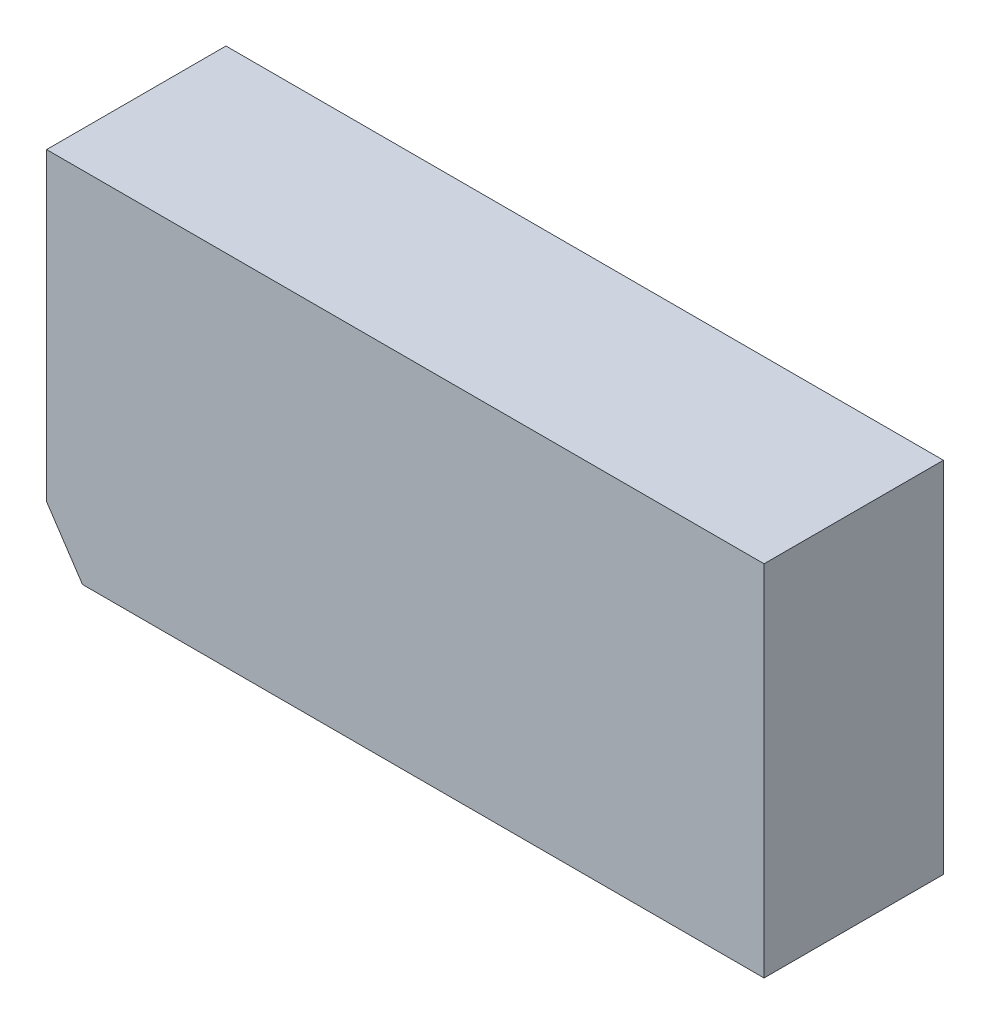
ISO-10303-21;
HEADER;
FILE_DESCRIPTION(('STEP AP214'),'2;1');
FILE_NAME('part.step','',(''),(''),'','','');
FILE_SCHEMA(('AUTOMOTIVE_DESIGN { 1 0 10303 214 1 1 1 1 }'));
ENDSEC;
DATA;
#1=APPLICATION_CONTEXT('core data for automotive mechanical design processes');
#2=APPLICATION_PROTOCOL_DEFINITION('international standard','automotive_design',2000,#1);
#3=PRODUCT_CONTEXT('',#1,'mechanical');
#4=PRODUCT('Part','Part','',(#3));
#5=PRODUCT_RELATED_PRODUCT_CATEGORY('part','',(#4));
#6=PRODUCT_DEFINITION_FORMATION('','',#4);
#7=PRODUCT_DEFINITION_CONTEXT('part definition',#1,'design');
#8=PRODUCT_DEFINITION('design','',#6,#7);
#9=PRODUCT_DEFINITION_SHAPE('','',#8);
#10=(LENGTH_UNIT() NAMED_UNIT(*) SI_UNIT(.MILLI.,.METRE.));
#11=(NAMED_UNIT(*) PLANE_ANGLE_UNIT() SI_UNIT($,.RADIAN.));
#12=(NAMED_UNIT(*) SI_UNIT($,.STERADIAN.) SOLID_ANGLE_UNIT());
#13=UNCERTAINTY_MEASURE_WITH_UNIT(LENGTH_MEASURE(1.E-05),#10,'distance_accuracy_value','');
#14=(GEOMETRIC_REPRESENTATION_CONTEXT(3) GLOBAL_UNCERTAINTY_ASSIGNED_CONTEXT((#13)) GLOBAL_UNIT_ASSIGNED_CONTEXT((#10,
#11,#12)) REPRESENTATION_CONTEXT('',''));
#15=CARTESIAN_POINT('',(0.,0.,0.));
#16=DIRECTION('',(0.,0.,1.));
#17=DIRECTION('',(1.,0.,0.));
#18=AXIS2_PLACEMENT_3D('',#15,#16,#17);
#19=CARTESIAN_POINT('',(0.,20.,10.));
#20=DIRECTION('',(1.,0.,0.));
#21=DIRECTION('',(0.,0.,-1.));
#22=AXIS2_PLACEMENT_3D('',#19,#20,#21);
#23=PLANE('',#22);
#24=DIRECTION('',(0.,-1.,0.));
#25=VECTOR('',#24,1.);
#26=CARTESIAN_POINT('',(0.,20.,0.));
#27=LINE('',#26,#25);
#28=CARTESIAN_POINT('',(0.,20.,0.));
#29=VERTEX_POINT('',#28);
#30=CARTESIAN_POINT('',(0.,3.00000000000002,0.));
#31=VERTEX_POINT('',#30);
#32=EDGE_CURVE('E120',#29,#31,#27,.T.);
#33=ORIENTED_EDGE('',*,*,#32,.T.);
#34=DIRECTION('',(0.,0.,1.));
#35=VECTOR('',#34,1.);
#36=CARTESIAN_POINT('',(0.,3.00000000000002,10.));
#37=LINE('',#36,#35);
#38=CARTESIAN_POINT('',(0.,3.00000000000002,10.));
#39=VERTEX_POINT('',#38);
#40=EDGE_CURVE('E52',#31,#39,#37,.T.);
#41=ORIENTED_EDGE('',*,*,#40,.T.);
#42=DIRECTION('',(0.,-1.,0.));
#43=VECTOR('',#42,1.);
#44=CARTESIAN_POINT('',(0.,20.,10.));
#45=LINE('',#44,#43);
#46=CARTESIAN_POINT('',(0.,20.,10.));
#47=VERTEX_POINT('',#46);
#48=EDGE_CURVE('E100',#47,#39,#45,.T.);
#49=ORIENTED_EDGE('',*,*,#48,.F.);
#50=DIRECTION('',(0.,0.,-1.));
#51=VECTOR('',#50,1.);
#52=CARTESIAN_POINT('',(0.,20.,10.));
#53=LINE('',#52,#51);
#54=EDGE_CURVE('E116',#47,#29,#53,.T.);
#55=ORIENTED_EDGE('',*,*,#54,.T.);
#56=EDGE_LOOP('',(#33,#41,#49,#55));
#57=FACE_BOUND('',#56,.T.);
#58=ADVANCED_FACE('F43',(#57),#23,.F.);
#59=CARTESIAN_POINT('',(0.,0.,10.));
#60=DIRECTION('',(0.,1.,0.));
#61=DIRECTION('',(0.,0.,1.));
#62=AXIS2_PLACEMENT_3D('',#59,#60,#61);
#63=PLANE('',#62);
#64=DIRECTION('',(1.,0.,0.));
#65=VECTOR('',#64,1.);
#66=CARTESIAN_POINT('',(0.,0.,10.));
#67=LINE('',#66,#65);
#68=CARTESIAN_POINT('',(2.00000000000001,0.,10.));
#69=VERTEX_POINT('',#68);
#70=CARTESIAN_POINT('',(40.,0.,10.));
#71=VERTEX_POINT('',#70);
#72=EDGE_CURVE('E90',#69,#71,#67,.T.);
#73=ORIENTED_EDGE('',*,*,#72,.F.);
#74=DIRECTION('',(0.,0.,-1.));
#75=VECTOR('',#74,1.);
#76=CARTESIAN_POINT('',(2.00000000000001,0.,10.));
#77=LINE('',#76,#75);
#78=CARTESIAN_POINT('',(2.00000000000001,0.,0.));
#79=VERTEX_POINT('',#78);
#80=EDGE_CURVE('E108',#69,#79,#77,.T.);
#81=ORIENTED_EDGE('',*,*,#80,.T.);
#82=DIRECTION('',(1.,0.,0.));
#83=VECTOR('',#82,1.);
#84=CARTESIAN_POINT('',(0.,0.,0.));
#85=LINE('',#84,#83);
#86=CARTESIAN_POINT('',(40.,0.,0.));
#87=VERTEX_POINT('',#86);
#88=EDGE_CURVE('E105',#79,#87,#85,.T.);
#89=ORIENTED_EDGE('',*,*,#88,.T.);
#90=DIRECTION('',(0.,0.,-1.));
#91=VECTOR('',#90,1.);
#92=CARTESIAN_POINT('',(40.,0.,10.));
#93=LINE('',#92,#91);
#94=EDGE_CURVE('E103',#71,#87,#93,.T.);
#95=ORIENTED_EDGE('',*,*,#94,.F.);
#96=EDGE_LOOP('',(#73,#81,#89,#95));
#97=FACE_BOUND('',#96,.T.);
#98=ADVANCED_FACE('F104',(#97),#63,.F.);
#99=CARTESIAN_POINT('',(40.,0.,10.));
#100=DIRECTION('',(-1.,0.,0.));
#101=DIRECTION('',(0.,0.,1.));
#102=AXIS2_PLACEMENT_3D('',#99,#100,#101);
#103=PLANE('',#102);
#104=DIRECTION('',(0.,1.,0.));
#105=VECTOR('',#104,1.);
#106=CARTESIAN_POINT('',(40.,0.,0.));
#107=LINE('',#106,#105);
#108=CARTESIAN_POINT('',(40.,20.,0.));
#109=VERTEX_POINT('',#108);
#110=EDGE_CURVE('E123',#87,#109,#107,.T.);
#111=ORIENTED_EDGE('',*,*,#110,.T.);
#112=DIRECTION('',(0.,0.,-1.));
#113=VECTOR('',#112,1.);
#114=CARTESIAN_POINT('',(40.,20.,10.));
#115=LINE('',#114,#113);
#116=CARTESIAN_POINT('',(40.,20.,10.));
#117=VERTEX_POINT('',#116);
#118=EDGE_CURVE('E109',#117,#109,#115,.T.);
#119=ORIENTED_EDGE('',*,*,#118,.F.);
#120=DIRECTION('',(0.,1.,0.));
#121=VECTOR('',#120,1.);
#122=CARTESIAN_POINT('',(40.,0.,10.));
#123=LINE('',#122,#121);
#124=EDGE_CURVE('E94',#71,#117,#123,.T.);
#125=ORIENTED_EDGE('',*,*,#124,.F.);
#126=ORIENTED_EDGE('',*,*,#94,.T.);
#127=EDGE_LOOP('',(#111,#119,#125,#126));
#128=FACE_BOUND('',#127,.T.);
#129=ADVANCED_FACE('F111',(#128),#103,.F.);
#130=CARTESIAN_POINT('',(40.,20.,10.));
#131=DIRECTION('',(0.,-1.,0.));
#132=DIRECTION('',(0.,0.,-1.));
#133=AXIS2_PLACEMENT_3D('',#130,#131,#132);
#134=PLANE('',#133);
#135=DIRECTION('',(-1.,0.,0.));
#136=VECTOR('',#135,1.);
#137=CARTESIAN_POINT('',(40.,20.,0.));
#138=LINE('',#137,#136);
#139=EDGE_CURVE('E125',#109,#29,#138,.T.);
#140=ORIENTED_EDGE('',*,*,#139,.T.);
#141=ORIENTED_EDGE('',*,*,#54,.F.);
#142=DIRECTION('',(-1.,0.,0.));
#143=VECTOR('',#142,1.);
#144=CARTESIAN_POINT('',(40.,20.,10.));
#145=LINE('',#144,#143);
#146=EDGE_CURVE('E114',#117,#47,#145,.T.);
#147=ORIENTED_EDGE('',*,*,#146,.F.);
#148=ORIENTED_EDGE('',*,*,#118,.T.);
#149=EDGE_LOOP('',(#140,#141,#147,#148));
#150=FACE_BOUND('',#149,.T.);
#151=ADVANCED_FACE('F135',(#150),#134,.F.);
#152=CARTESIAN_POINT('',(0.,0.,10.));
#153=DIRECTION('',(0.,0.,1.));
#154=DIRECTION('',(1.,0.,0.));
#155=AXIS2_PLACEMENT_3D('',#152,#153,#154);
#156=PLANE('',#155);
#157=ORIENTED_EDGE('',*,*,#48,.T.);
#158=DIRECTION('',(-0.554700196225229,0.832050294337844,0.));
#159=VECTOR('',#158,1.);
#160=CARTESIAN_POINT('',(1.38461538461539,0.923076923076927,10.));
#161=LINE('',#160,#159);
#162=EDGE_CURVE('E11',#39,#69,#161,.F.);
#163=ORIENTED_EDGE('',*,*,#162,.T.);
#164=ORIENTED_EDGE('',*,*,#72,.T.);
#165=ORIENTED_EDGE('',*,*,#124,.T.);
#166=ORIENTED_EDGE('',*,*,#146,.T.);
#167=EDGE_LOOP('',(#157,#163,#164,#165,#166));
#168=FACE_BOUND('',#167,.T.);
#169=ADVANCED_FACE('F92',(#168),#156,.T.);
#170=CARTESIAN_POINT('',(0.,0.,0.));
#171=DIRECTION('',(0.,0.,1.));
#172=DIRECTION('',(1.,0.,0.));
#173=AXIS2_PLACEMENT_3D('',#170,#171,#172);
#174=PLANE('',#173);
#175=ORIENTED_EDGE('',*,*,#88,.F.);
#176=DIRECTION('',(0.554700196225229,-0.832050294337844,0.));
#177=VECTOR('',#176,1.);
#178=CARTESIAN_POINT('',(2.00000000000001,0.,0.));
#179=LINE('',#178,#177);
#180=EDGE_CURVE('E66',#79,#31,#179,.F.);
#181=ORIENTED_EDGE('',*,*,#180,.T.);
#182=ORIENTED_EDGE('',*,*,#32,.F.);
#183=ORIENTED_EDGE('',*,*,#139,.F.);
#184=ORIENTED_EDGE('',*,*,#110,.F.);
#185=EDGE_LOOP('',(#175,#181,#182,#183,#184));
#186=FACE_BOUND('',#185,.T.);
#187=ADVANCED_FACE('F132',(#186),#174,.F.);
#188=CARTESIAN_POINT('',(2.00000000000001,0.,10.));
#189=DIRECTION('',(0.832050294337844,0.554700196225229,0.));
#190=DIRECTION('',(0.,0.,-1.));
#191=AXIS2_PLACEMENT_3D('',#188,#189,#190);
#192=PLANE('',#191);
#193=ORIENTED_EDGE('',*,*,#162,.F.);
#194=ORIENTED_EDGE('',*,*,#40,.F.);
#195=ORIENTED_EDGE('',*,*,#180,.F.);
#196=ORIENTED_EDGE('',*,*,#80,.F.);
#197=EDGE_LOOP('',(#193,#194,#195,#196));
#198=FACE_BOUND('',#197,.T.);
#199=ADVANCED_FACE('F46',(#198),#192,.F.);
#200=CLOSED_SHELL('',(#58,#98,#129,#151,#169,#187,#199));
#201=MANIFOLD_SOLID_BREP('B2',#200);
#202=ADVANCED_BREP_SHAPE_REPRESENTATION('',(#18,#201),#14);
#203=SHAPE_DEFINITION_REPRESENTATION(#9,#202);
ENDSEC;
END-ISO-10303-21;
